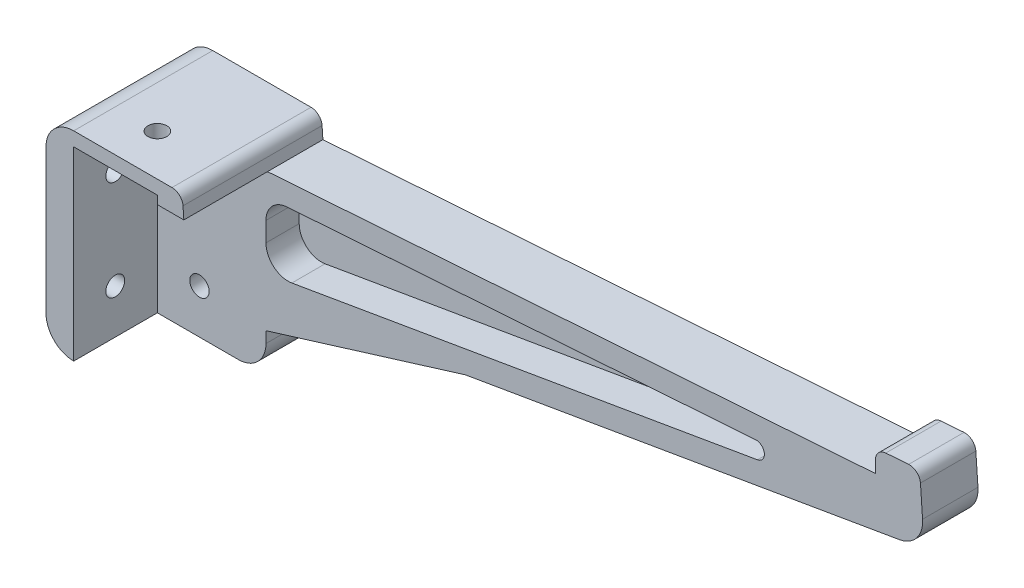
ISO-10303-21;
HEADER;
FILE_DESCRIPTION(('STEP AP214'),'2;1');
FILE_NAME('part.step','',(''),(''),'','','');
FILE_SCHEMA(('AUTOMOTIVE_DESIGN { 1 0 10303 214 1 1 1 1 }'));
ENDSEC;
DATA;
#1=APPLICATION_CONTEXT('core data for automotive mechanical design processes');
#2=APPLICATION_PROTOCOL_DEFINITION('international standard','automotive_design',2000,#1);
#3=PRODUCT_CONTEXT('',#1,'mechanical');
#4=PRODUCT('Part','Part','',(#3));
#5=PRODUCT_RELATED_PRODUCT_CATEGORY('part','',(#4));
#6=PRODUCT_DEFINITION_FORMATION('','',#4);
#7=PRODUCT_DEFINITION_CONTEXT('part definition',#1,'design');
#8=PRODUCT_DEFINITION('design','',#6,#7);
#9=PRODUCT_DEFINITION_SHAPE('','',#8);
#10=(LENGTH_UNIT() NAMED_UNIT(*) SI_UNIT(.MILLI.,.METRE.));
#11=(NAMED_UNIT(*) PLANE_ANGLE_UNIT() SI_UNIT($,.RADIAN.));
#12=(NAMED_UNIT(*) SI_UNIT($,.STERADIAN.) SOLID_ANGLE_UNIT());
#13=UNCERTAINTY_MEASURE_WITH_UNIT(LENGTH_MEASURE(1.E-05),#10,'distance_accuracy_value','');
#14=(GEOMETRIC_REPRESENTATION_CONTEXT(3) GLOBAL_UNCERTAINTY_ASSIGNED_CONTEXT((#13)) GLOBAL_UNIT_ASSIGNED_CONTEXT((#10,
#11,#12)) REPRESENTATION_CONTEXT('',''));
#15=CARTESIAN_POINT('',(0.,0.,0.));
#16=DIRECTION('',(0.,0.,1.));
#17=DIRECTION('',(1.,0.,0.));
#18=AXIS2_PLACEMENT_3D('',#15,#16,#17);
#19=CARTESIAN_POINT('',(124.011071423557,15.8276933308639,10.));
#20=DIRECTION('',(0.,0.,-1.));
#21=DIRECTION('',(-1.,0.,0.));
#22=AXIS2_PLACEMENT_3D('',#19,#20,#21);
#23=PLANE('',#22);
#24=CARTESIAN_POINT('',(0.,-18.,10.));
#25=DIRECTION('',(0.,0.,1.));
#26=DIRECTION('',(1.,0.,0.));
#27=AXIS2_PLACEMENT_3D('',#24,#25,#26);
#28=CIRCLE('',#27,1.75);
#29=CARTESIAN_POINT('',(1.75,-18.,10.));
#30=VERTEX_POINT('',#29);
#31=EDGE_CURVE('E345',#30,#30,#28,.T.);
#32=ORIENTED_EDGE('',*,*,#31,.F.);
#33=EDGE_LOOP('',(#32));
#34=FACE_BOUND('',#33,.T.);
#35=CARTESIAN_POINT('',(0.,0.,10.));
#36=DIRECTION('',(0.,0.,1.));
#37=DIRECTION('',(1.,0.,0.));
#38=AXIS2_PLACEMENT_3D('',#35,#36,#37);
#39=CIRCLE('',#38,1.75);
#40=CARTESIAN_POINT('',(1.75,0.,10.));
#41=VERTEX_POINT('',#40);
#42=EDGE_CURVE('E351',#41,#41,#39,.T.);
#43=ORIENTED_EDGE('',*,*,#42,.F.);
#44=EDGE_LOOP('',(#43));
#45=FACE_BOUND('',#44,.T.);
#46=CARTESIAN_POINT('',(100.464092384595,6.66281392015979,10.));
#47=DIRECTION('',(0.,0.,1.));
#48=DIRECTION('',(1.,0.,0.));
#49=AXIS2_PLACEMENT_3D('',#46,#47,#48);
#50=CIRCLE('',#49,1.5);
#51=CARTESIAN_POINT('',(100.717151125679,5.18431425037256,10.));
#52=VERTEX_POINT('',#51);
#53=CARTESIAN_POINT('',(100.359457673978,8.15915999554953,10.));
#54=VERTEX_POINT('',#53);
#55=EDGE_CURVE('E306',#52,#54,#50,.T.);
#56=ORIENTED_EDGE('',*,*,#55,.F.);
#57=DIRECTION('',(0.985666446524818,0.168705827389386,0.));
#58=VECTOR('',#57,1.);
#59=CARTESIAN_POINT('',(16.6748233095575,-9.20029882024365,10.));
#60=LINE('',#59,#58);
#61=CARTESIAN_POINT('',(16.6748233095575,-9.20029882024365,10.));
#62=VERTEX_POINT('',#61);
#63=EDGE_CURVE('E309',#62,#52,#60,.T.);
#64=ORIENTED_EDGE('',*,*,#63,.F.);
#65=CARTESIAN_POINT('',(16.,-5.25763303414438,10.));
#66=DIRECTION('',(0.,0.,1.));
#67=DIRECTION('',(-1.,0.,0.));
#68=AXIS2_PLACEMENT_3D('',#65,#66,#67);
#69=CIRCLE('',#68,4.);
#70=CARTESIAN_POINT('',(12.,-5.25763303414438,9.99999999999999));
#71=VERTEX_POINT('',#70);
#72=EDGE_CURVE('E296',#71,#62,#69,.T.);
#73=ORIENTED_EDGE('',*,*,#72,.F.);
#74=DIRECTION('',(0.,-1.,0.));
#75=VECTOR('',#74,1.);
#76=CARTESIAN_POINT('',(12.,-5.25763303414438,10.));
#77=LINE('',#76,#75);
#78=CARTESIAN_POINT('',(12.,-1.74959552920002,10.));
#79=VERTEX_POINT('',#78);
#80=EDGE_CURVE('E297',#79,#71,#77,.T.);
#81=ORIENTED_EDGE('',*,*,#80,.F.);
#82=CARTESIAN_POINT('',(16.,-1.74959552920002,10.));
#83=DIRECTION('',(0.,0.,1.));
#84=DIRECTION('',(-1.,0.,0.));
#85=AXIS2_PLACEMENT_3D('',#82,#83,#84);
#86=CIRCLE('',#85,4.);
#87=CARTESIAN_POINT('',(15.7209741050235,2.24066067183928,10.));
#88=VERTEX_POINT('',#87);
#89=EDGE_CURVE('E300',#88,#79,#86,.T.);
#90=ORIENTED_EDGE('',*,*,#89,.F.);
#91=DIRECTION('',(-0.997564050259824,-0.0697564737441258,0.));
#92=VECTOR('',#91,1.);
#93=CARTESIAN_POINT('',(15.7209741050235,2.24066067183928,10.));
#94=LINE('',#93,#92);
#95=EDGE_CURVE('E303',#54,#88,#94,.T.);
#96=ORIENTED_EDGE('',*,*,#95,.F.);
#97=EDGE_LOOP('',(#56,#64,#73,#81,#90,#96));
#98=FACE_BOUND('',#97,.T.);
#99=DIRECTION('',(1.,0.,0.));
#100=VECTOR('',#99,1.);
#101=CARTESIAN_POINT('',(12.2790258949765,6.00974379896071,10.));
#102=LINE('',#101,#100);
#103=CARTESIAN_POINT('',(7.50000000000001,6.0097437989607,10.));
#104=VERTEX_POINT('',#103);
#105=CARTESIAN_POINT('',(12.2790258949765,6.0097437989607,10.));
#106=VERTEX_POINT('',#105);
#107=EDGE_CURVE('E50',#104,#106,#102,.T.);
#108=ORIENTED_EDGE('',*,*,#107,.F.);
#109=DIRECTION('',(0.,-1.,0.));
#110=VECTOR('',#109,1.);
#111=CARTESIAN_POINT('',(7.50000000000001,6.0097437989607,10.));
#112=LINE('',#111,#110);
#113=CARTESIAN_POINT('',(7.50000000000001,7.5,10.));
#114=VERTEX_POINT('',#113);
#115=EDGE_CURVE('E54',#114,#104,#112,.T.);
#116=ORIENTED_EDGE('',*,*,#115,.F.);
#117=DIRECTION('',(1.,0.,0.));
#118=VECTOR('',#117,1.);
#119=CARTESIAN_POINT('',(7.50000000000001,7.5,10.));
#120=LINE('',#119,#118);
#121=CARTESIAN_POINT('',(-7.59999999999999,7.5,10.));
#122=VERTEX_POINT('',#121);
#123=EDGE_CURVE('E269',#122,#114,#120,.T.);
#124=ORIENTED_EDGE('',*,*,#123,.F.);
#125=DIRECTION('',(0.,1.,0.));
#126=VECTOR('',#125,1.);
#127=CARTESIAN_POINT('',(-7.59999999999999,7.5,10.));
#128=LINE('',#127,#126);
#129=CARTESIAN_POINT('',(-7.59999999999999,-26.,10.));
#130=VERTEX_POINT('',#129);
#131=EDGE_CURVE('E266',#130,#122,#128,.T.);
#132=ORIENTED_EDGE('',*,*,#131,.F.);
#133=DIRECTION('',(1.,0.,0.));
#134=VECTOR('',#133,1.);
#135=CARTESIAN_POINT('',(7.,-26.,10.));
#136=LINE('',#135,#134);
#137=CARTESIAN_POINT('',(7.,-26.,10.));
#138=VERTEX_POINT('',#137);
#139=EDGE_CURVE('E359',#130,#138,#136,.T.);
#140=ORIENTED_EDGE('',*,*,#139,.T.);
#141=CARTESIAN_POINT('',(7.,-21.,10.));
#142=DIRECTION('',(0.,0.,1.));
#143=DIRECTION('',(-1.,0.,0.));
#144=AXIS2_PLACEMENT_3D('',#141,#142,#143);
#145=CIRCLE('',#144,5.);
#146=CARTESIAN_POINT('',(12.,-21.,10.));
#147=VERTEX_POINT('',#146);
#148=EDGE_CURVE('E362',#138,#147,#145,.T.);
#149=ORIENTED_EDGE('',*,*,#148,.T.);
#150=DIRECTION('',(0.,1.,0.));
#151=VECTOR('',#150,1.);
#152=CARTESIAN_POINT('',(12.,-21.,10.));
#153=LINE('',#152,#151);
#154=CARTESIAN_POINT('',(12.,-18.9902562010393,10.));
#155=VERTEX_POINT('',#154);
#156=EDGE_CURVE('E364',#147,#155,#153,.T.);
#157=ORIENTED_EDGE('',*,*,#156,.T.);
#158=DIRECTION('',(0.955656131445848,0.294484903568854,0.));
#159=VECTOR('',#158,1.);
#160=CARTESIAN_POINT('',(12.,-18.9902562010393,10.));
#161=LINE('',#160,#159);
#162=CARTESIAN_POINT('',(48.,-7.8968762920553,10.));
#163=VERTEX_POINT('',#162);
#164=EDGE_CURVE('E286',#155,#163,#161,.T.);
#165=ORIENTED_EDGE('',*,*,#164,.T.);
#166=DIRECTION('',(0.985666446524818,0.168705827389386,0.));
#167=VECTOR('',#166,1.);
#168=CARTESIAN_POINT('',(12.,-14.0586055539481,10.));
#169=LINE('',#168,#167);
#170=CARTESIAN_POINT('',(126.368737699881,5.51664993858247,10.));
#171=VERTEX_POINT('',#170);
#172=EDGE_CURVE('E367',#163,#171,#169,.T.);
#173=ORIENTED_EDGE('',*,*,#172,.T.);
#174=CARTESIAN_POINT('',(125.525208562934,10.4449821712066,10.));
#175=DIRECTION('',(0.,0.,1.));
#176=DIRECTION('',(-1.,0.,0.));
#177=AXIS2_PLACEMENT_3D('',#174,#175,#176);
#178=CIRCLE('',#177,4.99999999999998);
#179=CARTESIAN_POINT('',(130.513028814233,10.7937645399272,10.));
#180=VERTEX_POINT('',#179);
#181=EDGE_CURVE('E369',#171,#180,#178,.T.);
#182=ORIENTED_EDGE('',*,*,#181,.T.);
#183=DIRECTION('',(-0.0697564737441267,0.997564050259824,0.));
#184=VECTOR('',#183,1.);
#185=CARTESIAN_POINT('',(130.131096773124,16.2556471925726,10.));
#186=LINE('',#185,#184);
#187=CARTESIAN_POINT('',(130.131096773124,16.2556471925726,10.));
#188=VERTEX_POINT('',#187);
#189=EDGE_CURVE('E371',#180,#188,#186,.T.);
#190=ORIENTED_EDGE('',*,*,#189,.T.);
#191=CARTESIAN_POINT('',(128.135968672604,16.1161342450843,10.));
#192=DIRECTION('',(0.,0.,1.));
#193=DIRECTION('',(-1.,0.,0.));
#194=AXIS2_PLACEMENT_3D('',#191,#192,#193);
#195=CIRCLE('',#194,1.99999999999999);
#196=CARTESIAN_POINT('',(127.996455725116,18.111262345604,10.));
#197=VERTEX_POINT('',#196);
#198=EDGE_CURVE('E373',#188,#197,#195,.T.);
#199=ORIENTED_EDGE('',*,*,#198,.T.);
#200=DIRECTION('',(-0.997564050259824,-0.0697564737441257,0.));
#201=VECTOR('',#200,1.);
#202=CARTESIAN_POINT('',(123.871558476069,17.8228214313835,10.));
#203=LINE('',#202,#201);
#204=CARTESIAN_POINT('',(123.871558476069,17.8228214313835,10.));
#205=VERTEX_POINT('',#204);
#206=EDGE_CURVE('E375',#197,#205,#203,.T.);
#207=ORIENTED_EDGE('',*,*,#206,.T.);
#208=CARTESIAN_POINT('',(124.011071423557,15.8276933308639,10.));
#209=DIRECTION('',(0.,0.,1.));
#210=DIRECTION('',(-1.,0.,0.));
#211=AXIS2_PLACEMENT_3D('',#208,#209,#210);
#212=CIRCLE('',#211,2.);
#213=CARTESIAN_POINT('',(122.011071423557,15.8276933308639,10.));
#214=VERTEX_POINT('',#213);
#215=EDGE_CURVE('E377',#205,#214,#212,.T.);
#216=ORIENTED_EDGE('',*,*,#215,.T.);
#217=DIRECTION('',(0.,-1.,0.));
#218=VECTOR('',#217,1.);
#219=CARTESIAN_POINT('',(122.011071423557,13.6829559108145,10.));
#220=LINE('',#219,#218);
#221=CARTESIAN_POINT('',(122.011071423557,13.6829559108145,10.));
#222=VERTEX_POINT('',#221);
#223=EDGE_CURVE('E379',#214,#222,#220,.T.);
#224=ORIENTED_EDGE('',*,*,#223,.T.);
#225=DIRECTION('',(-0.997564050259824,-0.0697564737441256,0.));
#226=VECTOR('',#225,1.);
#227=CARTESIAN_POINT('',(12.2790258949765,6.0097437989607,10.));
#228=LINE('',#227,#226);
#229=EDGE_CURVE('E357',#222,#106,#228,.T.);
#230=ORIENTED_EDGE('',*,*,#229,.T.);
#231=EDGE_LOOP('',(#108,#116,#124,#132,#140,#149,#157,#165,#173,#182,#190,#199,#207,#216,#224,#230));
#232=FACE_BOUND('',#231,.T.);
#233=ADVANCED_FACE('F35',(#34,#45,#98,#232),#23,.F.);
#234=CARTESIAN_POINT('',(124.011071423557,15.8276933308639,0.));
#235=DIRECTION('',(0.,0.,-1.));
#236=DIRECTION('',(-1.,0.,0.));
#237=AXIS2_PLACEMENT_3D('',#234,#235,#236);
#238=PLANE('',#237);
#239=DIRECTION('',(0.955656131445847,0.294484903568854,0.));
#240=VECTOR('',#239,1.);
#241=CARTESIAN_POINT('',(12.,-18.9902562010393,0.));
#242=LINE('',#241,#240);
#243=CARTESIAN_POINT('',(12.,-18.9902562010393,0.));
#244=VERTEX_POINT('',#243);
#245=CARTESIAN_POINT('',(48.,-7.8968762920553,0.));
#246=VERTEX_POINT('',#245);
#247=EDGE_CURVE('E289',#244,#246,#242,.T.);
#248=ORIENTED_EDGE('',*,*,#247,.F.);
#249=DIRECTION('',(0.,1.,0.));
#250=VECTOR('',#249,1.);
#251=CARTESIAN_POINT('',(12.,-21.,0.));
#252=LINE('',#251,#250);
#253=CARTESIAN_POINT('',(12.,-21.,0.));
#254=VERTEX_POINT('',#253);
#255=EDGE_CURVE('E399',#254,#244,#252,.T.);
#256=ORIENTED_EDGE('',*,*,#255,.F.);
#257=CARTESIAN_POINT('',(7.,-21.,0.));
#258=DIRECTION('',(0.,0.,1.));
#259=DIRECTION('',(-1.,0.,0.));
#260=AXIS2_PLACEMENT_3D('',#257,#258,#259);
#261=CIRCLE('',#260,5.);
#262=CARTESIAN_POINT('',(7.,-26.,0.));
#263=VERTEX_POINT('',#262);
#264=EDGE_CURVE('E397',#263,#254,#261,.T.);
#265=ORIENTED_EDGE('',*,*,#264,.F.);
#266=DIRECTION('',(1.,0.,0.));
#267=VECTOR('',#266,1.);
#268=CARTESIAN_POINT('',(7.,-26.,0.));
#269=LINE('',#268,#267);
#270=CARTESIAN_POINT('',(-7.59999999999999,-26.,0.));
#271=VERTEX_POINT('',#270);
#272=EDGE_CURVE('E395',#271,#263,#269,.T.);
#273=ORIENTED_EDGE('',*,*,#272,.F.);
#274=CARTESIAN_POINT('',(-7.59999999999999,-21.,0.));
#275=DIRECTION('',(0.,0.,1.));
#276=DIRECTION('',(-1.,0.,0.));
#277=AXIS2_PLACEMENT_3D('',#274,#275,#276);
#278=CIRCLE('',#277,5.);
#279=CARTESIAN_POINT('',(-12.6,-21.,0.));
#280=VERTEX_POINT('',#279);
#281=EDGE_CURVE('E393',#280,#271,#278,.T.);
#282=ORIENTED_EDGE('',*,*,#281,.F.);
#283=DIRECTION('',(0.,-1.,0.));
#284=VECTOR('',#283,1.);
#285=CARTESIAN_POINT('',(-12.6,-21.,0.));
#286=LINE('',#285,#284);
#287=CARTESIAN_POINT('',(-12.6,5.,0.));
#288=VERTEX_POINT('',#287);
#289=EDGE_CURVE('E391',#288,#280,#286,.T.);
#290=ORIENTED_EDGE('',*,*,#289,.F.);
#291=CARTESIAN_POINT('',(-7.59999999999999,5.,0.));
#292=DIRECTION('',(0.,0.,1.));
#293=DIRECTION('',(1.,0.,0.));
#294=AXIS2_PLACEMENT_3D('',#291,#292,#293);
#295=CIRCLE('',#294,5.);
#296=CARTESIAN_POINT('',(-7.59999999999999,10.,0.));
#297=VERTEX_POINT('',#296);
#298=EDGE_CURVE('E225',#297,#288,#295,.T.);
#299=ORIENTED_EDGE('',*,*,#298,.F.);
#300=DIRECTION('',(-1.,0.,0.));
#301=VECTOR('',#300,1.);
#302=CARTESIAN_POINT('',(-7.59999999999999,10.,0.));
#303=LINE('',#302,#301);
#304=CARTESIAN_POINT('',(10.1349698277247,10.,0.));
#305=VERTEX_POINT('',#304);
#306=EDGE_CURVE('E388',#305,#297,#303,.T.);
#307=ORIENTED_EDGE('',*,*,#306,.F.);
#308=CARTESIAN_POINT('',(10.1349698277247,8.,0.));
#309=DIRECTION('',(0.,0.,1.));
#310=DIRECTION('',(-1.,0.,0.));
#311=AXIS2_PLACEMENT_3D('',#308,#309,#310);
#312=CIRCLE('',#311,2.);
#313=CARTESIAN_POINT('',(12.1300979282443,8.13951294748825,0.));
#314=VERTEX_POINT('',#313);
#315=EDGE_CURVE('E386',#314,#305,#312,.T.);
#316=ORIENTED_EDGE('',*,*,#315,.F.);
#317=DIRECTION('',(-0.0697564737441258,0.997564050259824,0.));
#318=VECTOR('',#317,1.);
#319=CARTESIAN_POINT('',(12.1300979282443,8.13951294748825,0.));
#320=LINE('',#319,#318);
#321=CARTESIAN_POINT('',(12.2790258949765,6.0097437989607,0.));
#322=VERTEX_POINT('',#321);
#323=EDGE_CURVE('E384',#322,#314,#320,.T.);
#324=ORIENTED_EDGE('',*,*,#323,.F.);
#325=DIRECTION('',(-0.997564050259824,-0.0697564737441256,0.));
#326=VECTOR('',#325,1.);
#327=CARTESIAN_POINT('',(12.2790258949765,6.0097437989607,0.));
#328=LINE('',#327,#326);
#329=CARTESIAN_POINT('',(122.011071423557,13.6829559108145,0.));
#330=VERTEX_POINT('',#329);
#331=EDGE_CURVE('E354',#330,#322,#328,.T.);
#332=ORIENTED_EDGE('',*,*,#331,.F.);
#333=DIRECTION('',(0.,-1.,0.));
#334=VECTOR('',#333,1.);
#335=CARTESIAN_POINT('',(122.011071423557,13.6829559108145,0.));
#336=LINE('',#335,#334);
#337=CARTESIAN_POINT('',(122.011071423557,15.8276933308639,0.));
#338=VERTEX_POINT('',#337);
#339=EDGE_CURVE('E360',#338,#330,#336,.T.);
#340=ORIENTED_EDGE('',*,*,#339,.F.);
#341=CARTESIAN_POINT('',(124.011071423557,15.8276933308639,0.));
#342=DIRECTION('',(0.,0.,1.));
#343=DIRECTION('',(-1.,0.,0.));
#344=AXIS2_PLACEMENT_3D('',#341,#342,#343);
#345=CIRCLE('',#344,2.);
#346=CARTESIAN_POINT('',(123.871558476069,17.8228214313835,0.));
#347=VERTEX_POINT('',#346);
#348=EDGE_CURVE('E412',#347,#338,#345,.T.);
#349=ORIENTED_EDGE('',*,*,#348,.F.);
#350=DIRECTION('',(-0.997564050259824,-0.0697564737441257,0.));
#351=VECTOR('',#350,1.);
#352=CARTESIAN_POINT('',(123.871558476069,17.8228214313835,0.));
#353=LINE('',#352,#351);
#354=CARTESIAN_POINT('',(127.996455725116,18.111262345604,0.));
#355=VERTEX_POINT('',#354);
#356=EDGE_CURVE('E410',#355,#347,#353,.T.);
#357=ORIENTED_EDGE('',*,*,#356,.F.);
#358=CARTESIAN_POINT('',(128.135968672604,16.1161342450843,0.));
#359=DIRECTION('',(0.,0.,1.));
#360=DIRECTION('',(-1.,0.,0.));
#361=AXIS2_PLACEMENT_3D('',#358,#359,#360);
#362=CIRCLE('',#361,1.99999999999999);
#363=CARTESIAN_POINT('',(130.131096773124,16.2556471925726,0.));
#364=VERTEX_POINT('',#363);
#365=EDGE_CURVE('E408',#364,#355,#362,.T.);
#366=ORIENTED_EDGE('',*,*,#365,.F.);
#367=DIRECTION('',(-0.0697564737441267,0.997564050259824,0.));
#368=VECTOR('',#367,1.);
#369=CARTESIAN_POINT('',(130.131096773124,16.2556471925726,0.));
#370=LINE('',#369,#368);
#371=CARTESIAN_POINT('',(130.513028814233,10.7937645399272,0.));
#372=VERTEX_POINT('',#371);
#373=EDGE_CURVE('E406',#372,#364,#370,.T.);
#374=ORIENTED_EDGE('',*,*,#373,.F.);
#375=CARTESIAN_POINT('',(125.525208562934,10.4449821712066,0.));
#376=DIRECTION('',(0.,0.,1.));
#377=DIRECTION('',(-1.,0.,0.));
#378=AXIS2_PLACEMENT_3D('',#375,#376,#377);
#379=CIRCLE('',#378,4.99999999999998);
#380=CARTESIAN_POINT('',(126.368737699881,5.51664993858247,0.));
#381=VERTEX_POINT('',#380);
#382=EDGE_CURVE('E404',#381,#372,#379,.T.);
#383=ORIENTED_EDGE('',*,*,#382,.F.);
#384=DIRECTION('',(0.985666446524818,0.168705827389386,0.));
#385=VECTOR('',#384,1.);
#386=CARTESIAN_POINT('',(12.,-14.0586055539481,0.));
#387=LINE('',#386,#385);
#388=EDGE_CURVE('E402',#246,#381,#387,.T.);
#389=ORIENTED_EDGE('',*,*,#388,.F.);
#390=EDGE_LOOP('',(#248,#256,#265,#273,#282,#290,#299,#307,#316,#324,#332,#340,#349,#357,#366,
#374,#383,#389));
#391=FACE_BOUND('',#390,.T.);
#392=CARTESIAN_POINT('',(0.,0.,0.));
#393=DIRECTION('',(0.,0.,1.));
#394=DIRECTION('',(1.,0.,0.));
#395=AXIS2_PLACEMENT_3D('',#392,#393,#394);
#396=CIRCLE('',#395,1.75);
#397=CARTESIAN_POINT('',(1.75,0.,0.));
#398=VERTEX_POINT('',#397);
#399=EDGE_CURVE('E348',#398,#398,#396,.T.);
#400=ORIENTED_EDGE('',*,*,#399,.T.);
#401=EDGE_LOOP('',(#400));
#402=FACE_BOUND('',#401,.T.);
#403=CARTESIAN_POINT('',(0.,-18.,0.));
#404=DIRECTION('',(0.,0.,1.));
#405=DIRECTION('',(1.,0.,0.));
#406=AXIS2_PLACEMENT_3D('',#403,#404,#405);
#407=CIRCLE('',#406,1.75);
#408=CARTESIAN_POINT('',(1.75,-18.,0.));
#409=VERTEX_POINT('',#408);
#410=EDGE_CURVE('E344',#409,#409,#407,.T.);
#411=ORIENTED_EDGE('',*,*,#410,.T.);
#412=EDGE_LOOP('',(#411));
#413=FACE_BOUND('',#412,.T.);
#414=ADVANCED_FACE('F457',(#391,#402,#413),#238,.T.);
#415=CARTESIAN_POINT('',(12.2790258949765,6.0097437989607,10.));
#416=DIRECTION('',(0.0697564737441256,-0.997564050259824,0.));
#417=DIRECTION('',(0.997564050259824,0.0697564737441256,0.));
#418=AXIS2_PLACEMENT_3D('',#415,#416,#417);
#419=PLANE('',#418);
#420=ORIENTED_EDGE('',*,*,#331,.T.);
#421=DIRECTION('',(0.,0.,-1.));
#422=VECTOR('',#421,1.);
#423=CARTESIAN_POINT('',(12.2790258949765,6.0097437989607,10.));
#424=LINE('',#423,#422);
#425=EDGE_CURVE('E12',#106,#322,#424,.T.);
#426=ORIENTED_EDGE('',*,*,#425,.F.);
#427=ORIENTED_EDGE('',*,*,#229,.F.);
#428=DIRECTION('',(0.,0.,-1.));
#429=VECTOR('',#428,1.);
#430=CARTESIAN_POINT('',(122.011071423557,13.6829559108145,10.));
#431=LINE('',#430,#429);
#432=EDGE_CURVE('E381',#222,#330,#431,.T.);
#433=ORIENTED_EDGE('',*,*,#432,.T.);
#434=EDGE_LOOP('',(#420,#426,#427,#433));
#435=FACE_BOUND('',#434,.T.);
#436=ADVANCED_FACE('F37',(#435),#419,.F.);
#437=CARTESIAN_POINT('',(12.1300979282443,8.13951294748825,10.));
#438=DIRECTION('',(-0.997564050259824,-0.0697564737441258,0.));
#439=DIRECTION('',(0.0697564737441258,-0.997564050259824,0.));
#440=AXIS2_PLACEMENT_3D('',#437,#438,#439);
#441=PLANE('',#440);
#442=ORIENTED_EDGE('',*,*,#323,.T.);
#443=DIRECTION('',(0.,0.,-1.));
#444=VECTOR('',#443,1.);
#445=CARTESIAN_POINT('',(12.1300979282443,8.13951294748825,10.));
#446=LINE('',#445,#444);
#447=CARTESIAN_POINT('',(12.1300979282443,8.13951294748825,25.1));
#448=VERTEX_POINT('',#447);
#449=EDGE_CURVE('E43',#448,#314,#446,.T.);
#450=ORIENTED_EDGE('',*,*,#449,.F.);
#451=DIRECTION('',(-0.0697564737441258,0.997564050259824,0.));
#452=VECTOR('',#451,1.);
#453=CARTESIAN_POINT('',(12.1300979282443,8.13951294748825,25.1));
#454=LINE('',#453,#452);
#455=CARTESIAN_POINT('',(12.2790258949765,6.00974379896071,25.1));
#456=VERTEX_POINT('',#455);
#457=EDGE_CURVE('E259',#456,#448,#454,.T.);
#458=ORIENTED_EDGE('',*,*,#457,.F.);
#459=DIRECTION('',(0.,0.,-1.));
#460=VECTOR('',#459,1.);
#461=CARTESIAN_POINT('',(12.2790258949765,6.00974379896071,25.1));
#462=LINE('',#461,#460);
#463=EDGE_CURVE('E265',#456,#106,#462,.T.);
#464=ORIENTED_EDGE('',*,*,#463,.T.);
#465=ORIENTED_EDGE('',*,*,#425,.T.);
#466=EDGE_LOOP('',(#442,#450,#458,#464,#465));
#467=FACE_BOUND('',#466,.T.);
#468=ADVANCED_FACE('F464',(#467),#441,.F.);
#469=CARTESIAN_POINT('',(10.1349698277247,8.,10.));
#470=DIRECTION('',(0.,0.,-1.));
#471=DIRECTION('',(-1.,0.,0.));
#472=AXIS2_PLACEMENT_3D('',#469,#470,#471);
#473=CYLINDRICAL_SURFACE('',#472,2.);
#474=ORIENTED_EDGE('',*,*,#315,.T.);
#475=DIRECTION('',(0.,0.,-1.));
#476=VECTOR('',#475,1.);
#477=CARTESIAN_POINT('',(10.1349698277247,10.,10.));
#478=LINE('',#477,#476);
#479=CARTESIAN_POINT('',(10.1349698277247,10.,25.1));
#480=VERTEX_POINT('',#479);
#481=EDGE_CURVE('E446',#480,#305,#478,.T.);
#482=ORIENTED_EDGE('',*,*,#481,.F.);
#483=CARTESIAN_POINT('',(10.1349698277247,8.,25.1));
#484=DIRECTION('',(0.,0.,1.));
#485=DIRECTION('',(-1.,0.,0.));
#486=AXIS2_PLACEMENT_3D('',#483,#484,#485);
#487=CIRCLE('',#486,2.);
#488=EDGE_CURVE('E262',#448,#480,#487,.T.);
#489=ORIENTED_EDGE('',*,*,#488,.F.);
#490=ORIENTED_EDGE('',*,*,#449,.T.);
#491=EDGE_LOOP('',(#474,#482,#489,#490));
#492=FACE_BOUND('',#491,.T.);
#493=ADVANCED_FACE('F452',(#492),#473,.T.);
#494=CARTESIAN_POINT('',(-7.59999999999999,10.,10.));
#495=DIRECTION('',(0.,-1.,0.));
#496=DIRECTION('',(0.,0.,-1.));
#497=AXIS2_PLACEMENT_3D('',#494,#495,#496);
#498=PLANE('',#497);
#499=CARTESIAN_POINT('',(0.,10.,17.6));
#500=DIRECTION('',(0.,1.,0.));
#501=DIRECTION('',(0.,0.,1.));
#502=AXIS2_PLACEMENT_3D('',#499,#500,#501);
#503=CIRCLE('',#502,1.69999999999999);
#504=CARTESIAN_POINT('',(0.,10.,19.3));
#505=VERTEX_POINT('',#504);
#506=EDGE_CURVE('E892',#505,#505,#503,.T.);
#507=ORIENTED_EDGE('',*,*,#506,.F.);
#508=EDGE_LOOP('',(#507));
#509=FACE_BOUND('',#508,.T.);
#510=ORIENTED_EDGE('',*,*,#306,.T.);
#511=DIRECTION('',(0.,0.,-1.));
#512=VECTOR('',#511,1.);
#513=CARTESIAN_POINT('',(-7.59999999999999,10.,10.));
#514=LINE('',#513,#512);
#515=CARTESIAN_POINT('',(-7.59999999999999,10.,25.1));
#516=VERTEX_POINT('',#515);
#517=EDGE_CURVE('E228',#516,#297,#514,.T.);
#518=ORIENTED_EDGE('',*,*,#517,.F.);
#519=DIRECTION('',(-1.,0.,0.));
#520=VECTOR('',#519,1.);
#521=CARTESIAN_POINT('',(-7.59999999999999,10.,25.1));
#522=LINE('',#521,#520);
#523=EDGE_CURVE('E243',#480,#516,#522,.T.);
#524=ORIENTED_EDGE('',*,*,#523,.F.);
#525=ORIENTED_EDGE('',*,*,#481,.T.);
#526=EDGE_LOOP('',(#510,#518,#524,#525));
#527=FACE_BOUND('',#526,.T.);
#528=ADVANCED_FACE('F461',(#509,#527),#498,.F.);
#529=CARTESIAN_POINT('',(-7.59999999999999,5.,10.));
#530=DIRECTION('',(0.,0.,-1.));
#531=DIRECTION('',(-1.,0.,0.));
#532=AXIS2_PLACEMENT_3D('',#529,#530,#531);
#533=CYLINDRICAL_SURFACE('',#532,5.);
#534=ORIENTED_EDGE('',*,*,#298,.T.);
#535=DIRECTION('',(0.,0.,-1.));
#536=VECTOR('',#535,1.);
#537=CARTESIAN_POINT('',(-12.6,5.,10.));
#538=LINE('',#537,#536);
#539=CARTESIAN_POINT('',(-12.6,5.,25.1));
#540=VERTEX_POINT('',#539);
#541=EDGE_CURVE('E218',#540,#288,#538,.T.);
#542=ORIENTED_EDGE('',*,*,#541,.F.);
#543=CARTESIAN_POINT('',(-7.6,5.,25.1));
#544=DIRECTION('',(0.,0.,1.));
#545=DIRECTION('',(-1.,0.,0.));
#546=AXIS2_PLACEMENT_3D('',#543,#544,#545);
#547=CIRCLE('',#546,5.);
#548=EDGE_CURVE('E223',#516,#540,#547,.T.);
#549=ORIENTED_EDGE('',*,*,#548,.F.);
#550=ORIENTED_EDGE('',*,*,#517,.T.);
#551=EDGE_LOOP('',(#534,#542,#549,#550));
#552=FACE_BOUND('',#551,.T.);
#553=ADVANCED_FACE('F220',(#552),#533,.T.);
#554=CARTESIAN_POINT('',(-12.6,-21.,10.));
#555=DIRECTION('',(1.,0.,0.));
#556=DIRECTION('',(0.,0.,-1.));
#557=AXIS2_PLACEMENT_3D('',#554,#555,#556);
#558=PLANE('',#557);
#559=CARTESIAN_POINT('',(-12.6,-18.,17.6));
#560=DIRECTION('',(1.,0.,0.));
#561=DIRECTION('',(0.,0.,-1.));
#562=AXIS2_PLACEMENT_3D('',#559,#560,#561);
#563=CIRCLE('',#562,1.7);
#564=CARTESIAN_POINT('',(-12.6,-18.,15.9));
#565=VERTEX_POINT('',#564);
#566=EDGE_CURVE('E899',#565,#565,#563,.T.);
#567=ORIENTED_EDGE('',*,*,#566,.T.);
#568=EDGE_LOOP('',(#567));
#569=FACE_BOUND('',#568,.T.);
#570=CARTESIAN_POINT('',(-12.6,0.,17.6));
#571=DIRECTION('',(1.,0.,0.));
#572=DIRECTION('',(0.,0.,-1.));
#573=AXIS2_PLACEMENT_3D('',#570,#571,#572);
#574=CIRCLE('',#573,1.7);
#575=CARTESIAN_POINT('',(-12.6,0.,15.9));
#576=VERTEX_POINT('',#575);
#577=EDGE_CURVE('E247',#576,#576,#574,.T.);
#578=ORIENTED_EDGE('',*,*,#577,.T.);
#579=EDGE_LOOP('',(#578));
#580=FACE_BOUND('',#579,.T.);
#581=ORIENTED_EDGE('',*,*,#289,.T.);
#582=DIRECTION('',(0.,0.,-1.));
#583=VECTOR('',#582,1.);
#584=CARTESIAN_POINT('',(-12.6,-21.,10.));
#585=LINE('',#584,#583);
#586=CARTESIAN_POINT('',(-12.6,-21.,25.1));
#587=VERTEX_POINT('',#586);
#588=EDGE_CURVE('E229',#587,#280,#585,.T.);
#589=ORIENTED_EDGE('',*,*,#588,.F.);
#590=DIRECTION('',(0.,-1.,0.));
#591=VECTOR('',#590,1.);
#592=CARTESIAN_POINT('',(-12.6,-21.,25.1));
#593=LINE('',#592,#591);
#594=EDGE_CURVE('E232',#540,#587,#593,.T.);
#595=ORIENTED_EDGE('',*,*,#594,.F.);
#596=ORIENTED_EDGE('',*,*,#541,.T.);
#597=EDGE_LOOP('',(#581,#589,#595,#596));
#598=FACE_BOUND('',#597,.T.);
#599=ADVANCED_FACE('F233',(#569,#580,#598),#558,.F.);
#600=CARTESIAN_POINT('',(-7.59999999999999,-21.,10.));
#601=DIRECTION('',(0.,0.,-1.));
#602=DIRECTION('',(-1.,0.,0.));
#603=AXIS2_PLACEMENT_3D('',#600,#601,#602);
#604=CYLINDRICAL_SURFACE('',#603,5.);
#605=ORIENTED_EDGE('',*,*,#281,.T.);
#606=DIRECTION('',(0.,0.,-1.));
#607=VECTOR('',#606,1.);
#608=CARTESIAN_POINT('',(-7.59999999999999,-26.,10.));
#609=LINE('',#608,#607);
#610=EDGE_CURVE('E441',#130,#271,#609,.T.);
#611=ORIENTED_EDGE('',*,*,#610,.F.);
#612=DIRECTION('',(0.,0.,-1.));
#613=VECTOR('',#612,1.);
#614=CARTESIAN_POINT('',(-7.59999999999999,-26.,25.1));
#615=LINE('',#614,#613);
#616=CARTESIAN_POINT('',(-7.59999999999999,-26.,25.1));
#617=VERTEX_POINT('',#616);
#618=EDGE_CURVE('E283',#617,#130,#615,.T.);
#619=ORIENTED_EDGE('',*,*,#618,.F.);
#620=CARTESIAN_POINT('',(-7.59999999999999,-21.,25.1));
#621=DIRECTION('',(0.,0.,1.));
#622=DIRECTION('',(1.,0.,0.));
#623=AXIS2_PLACEMENT_3D('',#620,#621,#622);
#624=CIRCLE('',#623,5.);
#625=EDGE_CURVE('E237',#587,#617,#624,.T.);
#626=ORIENTED_EDGE('',*,*,#625,.F.);
#627=ORIENTED_EDGE('',*,*,#588,.T.);
#628=EDGE_LOOP('',(#605,#611,#619,#626,#627));
#629=FACE_BOUND('',#628,.T.);
#630=ADVANCED_FACE('F483',(#629),#604,.T.);
#631=CARTESIAN_POINT('',(7.,-26.,10.));
#632=DIRECTION('',(0.,1.,0.));
#633=DIRECTION('',(0.,0.,1.));
#634=AXIS2_PLACEMENT_3D('',#631,#632,#633);
#635=PLANE('',#634);
#636=ORIENTED_EDGE('',*,*,#272,.T.);
#637=DIRECTION('',(0.,0.,-1.));
#638=VECTOR('',#637,1.);
#639=CARTESIAN_POINT('',(7.,-26.,10.));
#640=LINE('',#639,#638);
#641=EDGE_CURVE('E438',#138,#263,#640,.T.);
#642=ORIENTED_EDGE('',*,*,#641,.F.);
#643=ORIENTED_EDGE('',*,*,#139,.F.);
#644=ORIENTED_EDGE('',*,*,#610,.T.);
#645=EDGE_LOOP('',(#636,#642,#643,#644));
#646=FACE_BOUND('',#645,.T.);
#647=ADVANCED_FACE('F489',(#646),#635,.F.);
#648=CARTESIAN_POINT('',(7.,-21.,10.));
#649=DIRECTION('',(0.,0.,-1.));
#650=DIRECTION('',(-1.,0.,0.));
#651=AXIS2_PLACEMENT_3D('',#648,#649,#650);
#652=CYLINDRICAL_SURFACE('',#651,5.);
#653=ORIENTED_EDGE('',*,*,#264,.T.);
#654=DIRECTION('',(0.,0.,-1.));
#655=VECTOR('',#654,1.);
#656=CARTESIAN_POINT('',(12.,-21.,10.));
#657=LINE('',#656,#655);
#658=EDGE_CURVE('E435',#147,#254,#657,.T.);
#659=ORIENTED_EDGE('',*,*,#658,.F.);
#660=ORIENTED_EDGE('',*,*,#148,.F.);
#661=ORIENTED_EDGE('',*,*,#641,.T.);
#662=EDGE_LOOP('',(#653,#659,#660,#661));
#663=FACE_BOUND('',#662,.T.);
#664=ADVANCED_FACE('F494',(#663),#652,.T.);
#665=CARTESIAN_POINT('',(12.,-21.,10.));
#666=DIRECTION('',(-1.,0.,0.));
#667=DIRECTION('',(0.,-1.,0.));
#668=AXIS2_PLACEMENT_3D('',#665,#666,#667);
#669=PLANE('',#668);
#670=ORIENTED_EDGE('',*,*,#255,.T.);
#671=DIRECTION('',(0.,0.,1.));
#672=VECTOR('',#671,1.);
#673=CARTESIAN_POINT('',(12.,-18.9902562010393,-37.6704536448003));
#674=LINE('',#673,#672);
#675=EDGE_CURVE('E293',#244,#155,#674,.T.);
#676=ORIENTED_EDGE('',*,*,#675,.T.);
#677=ORIENTED_EDGE('',*,*,#156,.F.);
#678=ORIENTED_EDGE('',*,*,#658,.T.);
#679=EDGE_LOOP('',(#670,#676,#677,#678));
#680=FACE_BOUND('',#679,.T.);
#681=ADVANCED_FACE('F498',(#680),#669,.F.);
#682=CARTESIAN_POINT('',(12.,-14.0586055539481,10.));
#683=DIRECTION('',(-0.168705827389386,0.985666446524818,0.));
#684=DIRECTION('',(-0.985666446524818,-0.168705827389386,0.));
#685=AXIS2_PLACEMENT_3D('',#682,#683,#684);
#686=PLANE('',#685);
#687=ORIENTED_EDGE('',*,*,#172,.F.);
#688=DIRECTION('',(0.,0.,1.));
#689=VECTOR('',#688,1.);
#690=CARTESIAN_POINT('',(48.,-7.8968762920553,-37.6704536448003));
#691=LINE('',#690,#689);
#692=EDGE_CURVE('E291',#246,#163,#691,.T.);
#693=ORIENTED_EDGE('',*,*,#692,.F.);
#694=ORIENTED_EDGE('',*,*,#388,.T.);
#695=DIRECTION('',(0.,0.,-1.));
#696=VECTOR('',#695,1.);
#697=CARTESIAN_POINT('',(126.368737699881,5.51664993858247,10.));
#698=LINE('',#697,#696);
#699=EDGE_CURVE('E432',#171,#381,#698,.T.);
#700=ORIENTED_EDGE('',*,*,#699,.F.);
#701=EDGE_LOOP('',(#687,#693,#694,#700));
#702=FACE_BOUND('',#701,.T.);
#703=ADVANCED_FACE('F506',(#702),#686,.F.);
#704=CARTESIAN_POINT('',(125.525208562934,10.4449821712066,10.));
#705=DIRECTION('',(0.,0.,-1.));
#706=DIRECTION('',(-1.,0.,0.));
#707=AXIS2_PLACEMENT_3D('',#704,#705,#706);
#708=CYLINDRICAL_SURFACE('',#707,4.99999999999998);
#709=ORIENTED_EDGE('',*,*,#382,.T.);
#710=DIRECTION('',(0.,0.,-1.));
#711=VECTOR('',#710,1.);
#712=CARTESIAN_POINT('',(130.513028814233,10.7937645399272,10.));
#713=LINE('',#712,#711);
#714=EDGE_CURVE('E429',#180,#372,#713,.T.);
#715=ORIENTED_EDGE('',*,*,#714,.F.);
#716=ORIENTED_EDGE('',*,*,#181,.F.);
#717=ORIENTED_EDGE('',*,*,#699,.T.);
#718=EDGE_LOOP('',(#709,#715,#716,#717));
#719=FACE_BOUND('',#718,.T.);
#720=ADVANCED_FACE('F512',(#719),#708,.T.);
#721=CARTESIAN_POINT('',(130.131096773124,16.2556471925726,10.));
#722=DIRECTION('',(-0.997564050259824,-0.0697564737441267,0.));
#723=DIRECTION('',(0.0697564737441267,-0.997564050259824,0.));
#724=AXIS2_PLACEMENT_3D('',#721,#722,#723);
#725=PLANE('',#724);
#726=ORIENTED_EDGE('',*,*,#373,.T.);
#727=DIRECTION('',(0.,0.,-1.));
#728=VECTOR('',#727,1.);
#729=CARTESIAN_POINT('',(130.131096773124,16.2556471925726,10.));
#730=LINE('',#729,#728);
#731=EDGE_CURVE('E426',#188,#364,#730,.T.);
#732=ORIENTED_EDGE('',*,*,#731,.F.);
#733=ORIENTED_EDGE('',*,*,#189,.F.);
#734=ORIENTED_EDGE('',*,*,#714,.T.);
#735=EDGE_LOOP('',(#726,#732,#733,#734));
#736=FACE_BOUND('',#735,.T.);
#737=ADVANCED_FACE('F518',(#736),#725,.F.);
#738=CARTESIAN_POINT('',(128.135968672604,16.1161342450843,10.));
#739=DIRECTION('',(0.,0.,-1.));
#740=DIRECTION('',(-1.,0.,0.));
#741=AXIS2_PLACEMENT_3D('',#738,#739,#740);
#742=CYLINDRICAL_SURFACE('',#741,1.99999999999999);
#743=ORIENTED_EDGE('',*,*,#365,.T.);
#744=DIRECTION('',(0.,0.,-1.));
#745=VECTOR('',#744,1.);
#746=CARTESIAN_POINT('',(127.996455725116,18.111262345604,10.));
#747=LINE('',#746,#745);
#748=EDGE_CURVE('E423',#197,#355,#747,.T.);
#749=ORIENTED_EDGE('',*,*,#748,.F.);
#750=ORIENTED_EDGE('',*,*,#198,.F.);
#751=ORIENTED_EDGE('',*,*,#731,.T.);
#752=EDGE_LOOP('',(#743,#749,#750,#751));
#753=FACE_BOUND('',#752,.T.);
#754=ADVANCED_FACE('F522',(#753),#742,.T.);
#755=CARTESIAN_POINT('',(123.871558476069,17.8228214313835,10.));
#756=DIRECTION('',(0.0697564737441257,-0.997564050259824,0.));
#757=DIRECTION('',(0.997564050259824,0.0697564737441257,0.));
#758=AXIS2_PLACEMENT_3D('',#755,#756,#757);
#759=PLANE('',#758);
#760=ORIENTED_EDGE('',*,*,#356,.T.);
#761=DIRECTION('',(0.,0.,-1.));
#762=VECTOR('',#761,1.);
#763=CARTESIAN_POINT('',(123.871558476069,17.8228214313835,10.));
#764=LINE('',#763,#762);
#765=EDGE_CURVE('E420',#205,#347,#764,.T.);
#766=ORIENTED_EDGE('',*,*,#765,.F.);
#767=ORIENTED_EDGE('',*,*,#206,.F.);
#768=ORIENTED_EDGE('',*,*,#748,.T.);
#769=EDGE_LOOP('',(#760,#766,#767,#768));
#770=FACE_BOUND('',#769,.T.);
#771=ADVANCED_FACE('F527',(#770),#759,.F.);
#772=CARTESIAN_POINT('',(124.011071423557,15.8276933308639,10.));
#773=DIRECTION('',(0.,0.,-1.));
#774=DIRECTION('',(-1.,0.,0.));
#775=AXIS2_PLACEMENT_3D('',#772,#773,#774);
#776=CYLINDRICAL_SURFACE('',#775,2.);
#777=ORIENTED_EDGE('',*,*,#348,.T.);
#778=DIRECTION('',(0.,0.,-1.));
#779=VECTOR('',#778,1.);
#780=CARTESIAN_POINT('',(122.011071423557,15.8276933308639,10.));
#781=LINE('',#780,#779);
#782=EDGE_CURVE('E417',#214,#338,#781,.T.);
#783=ORIENTED_EDGE('',*,*,#782,.F.);
#784=ORIENTED_EDGE('',*,*,#215,.F.);
#785=ORIENTED_EDGE('',*,*,#765,.T.);
#786=EDGE_LOOP('',(#777,#783,#784,#785));
#787=FACE_BOUND('',#786,.T.);
#788=ADVANCED_FACE('F533',(#787),#776,.T.);
#789=CARTESIAN_POINT('',(122.011071423557,13.6829559108145,10.));
#790=DIRECTION('',(1.,0.,0.));
#791=DIRECTION('',(0.,0.,-1.));
#792=AXIS2_PLACEMENT_3D('',#789,#790,#791);
#793=PLANE('',#792);
#794=ORIENTED_EDGE('',*,*,#339,.T.);
#795=ORIENTED_EDGE('',*,*,#432,.F.);
#796=ORIENTED_EDGE('',*,*,#223,.F.);
#797=ORIENTED_EDGE('',*,*,#782,.T.);
#798=EDGE_LOOP('',(#794,#795,#796,#797));
#799=FACE_BOUND('',#798,.T.);
#800=ADVANCED_FACE('F537',(#799),#793,.F.);
#801=CARTESIAN_POINT('',(0.,0.,10.));
#802=DIRECTION('',(0.,0.,-1.));
#803=DIRECTION('',(-1.,0.,0.));
#804=AXIS2_PLACEMENT_3D('',#801,#802,#803);
#805=CYLINDRICAL_SURFACE('',#804,1.75);
#806=ORIENTED_EDGE('',*,*,#42,.T.);
#807=EDGE_LOOP('',(#806));
#808=FACE_BOUND('',#807,.T.);
#809=ORIENTED_EDGE('',*,*,#399,.F.);
#810=EDGE_LOOP('',(#809));
#811=FACE_BOUND('',#810,.T.);
#812=ADVANCED_FACE('F554',(#808,#811),#805,.F.);
#813=CARTESIAN_POINT('',(0.,-18.,10.));
#814=DIRECTION('',(0.,0.,-1.));
#815=DIRECTION('',(-1.,0.,0.));
#816=AXIS2_PLACEMENT_3D('',#813,#814,#815);
#817=CYLINDRICAL_SURFACE('',#816,1.75);
#818=ORIENTED_EDGE('',*,*,#31,.T.);
#819=EDGE_LOOP('',(#818));
#820=FACE_BOUND('',#819,.T.);
#821=ORIENTED_EDGE('',*,*,#410,.F.);
#822=EDGE_LOOP('',(#821));
#823=FACE_BOUND('',#822,.T.);
#824=ADVANCED_FACE('F661',(#820,#823),#817,.F.);
#825=CARTESIAN_POINT('',(124.011071423557,15.8276933308639,4.));
#826=DIRECTION('',(0.,0.,-1.));
#827=DIRECTION('',(-1.,0.,0.));
#828=AXIS2_PLACEMENT_3D('',#825,#826,#827);
#829=PLANE('',#828);
#830=CARTESIAN_POINT('',(16.,-5.25763303414438,4.));
#831=DIRECTION('',(0.,0.,-1.));
#832=DIRECTION('',(-1.,0.,0.));
#833=AXIS2_PLACEMENT_3D('',#830,#831,#832);
#834=CIRCLE('',#833,4.);
#835=CARTESIAN_POINT('',(12.,-5.25763303414438,4.));
#836=VERTEX_POINT('',#835);
#837=CARTESIAN_POINT('',(16.6748233095575,-9.20029882024365,4.));
#838=VERTEX_POINT('',#837);
#839=EDGE_CURVE('E317',#836,#838,#834,.F.);
#840=ORIENTED_EDGE('',*,*,#839,.T.);
#841=DIRECTION('',(0.985666446524818,0.168705827389386,0.));
#842=VECTOR('',#841,1.);
#843=CARTESIAN_POINT('',(16.6748233095575,-9.20029882024365,4.));
#844=LINE('',#843,#842);
#845=CARTESIAN_POINT('',(100.717151125679,5.18431425037256,4.));
#846=VERTEX_POINT('',#845);
#847=EDGE_CURVE('E299',#838,#846,#844,.T.);
#848=ORIENTED_EDGE('',*,*,#847,.T.);
#849=CARTESIAN_POINT('',(100.464092384595,6.66281392015979,4.));
#850=DIRECTION('',(0.,0.,-1.));
#851=DIRECTION('',(-1.,0.,0.));
#852=AXIS2_PLACEMENT_3D('',#849,#850,#851);
#853=CIRCLE('',#852,1.5);
#854=CARTESIAN_POINT('',(100.359457673978,8.15915999554953,4.));
#855=VERTEX_POINT('',#854);
#856=EDGE_CURVE('E334',#846,#855,#853,.F.);
#857=ORIENTED_EDGE('',*,*,#856,.T.);
#858=DIRECTION('',(-0.997564050259824,-0.0697564737441258,0.));
#859=VECTOR('',#858,1.);
#860=CARTESIAN_POINT('',(15.7209741050235,2.24066067183928,4.));
#861=LINE('',#860,#859);
#862=CARTESIAN_POINT('',(15.7209741050235,2.24066067183928,4.));
#863=VERTEX_POINT('',#862);
#864=EDGE_CURVE('E330',#855,#863,#861,.T.);
#865=ORIENTED_EDGE('',*,*,#864,.T.);
#866=CARTESIAN_POINT('',(16.,-1.74959552920002,4.));
#867=DIRECTION('',(0.,0.,-1.));
#868=DIRECTION('',(-1.,0.,0.));
#869=AXIS2_PLACEMENT_3D('',#866,#867,#868);
#870=CIRCLE('',#869,4.);
#871=CARTESIAN_POINT('',(12.,-1.74959552920002,4.));
#872=VERTEX_POINT('',#871);
#873=EDGE_CURVE('E326',#863,#872,#870,.F.);
#874=ORIENTED_EDGE('',*,*,#873,.T.);
#875=DIRECTION('',(0.,-1.,0.));
#876=VECTOR('',#875,1.);
#877=CARTESIAN_POINT('',(12.,-5.25763303414438,4.));
#878=LINE('',#877,#876);
#879=EDGE_CURVE('E322',#872,#836,#878,.T.);
#880=ORIENTED_EDGE('',*,*,#879,.T.);
#881=EDGE_LOOP('',(#840,#848,#857,#865,#874,#880));
#882=FACE_BOUND('',#881,.T.);
#883=ADVANCED_FACE('F668',(#882),#829,.F.);
#884=CARTESIAN_POINT('',(16.6748233095575,-9.20029882024365,-91.6352000634669));
#885=DIRECTION('',(0.168705827389386,-0.985666446524818,0.));
#886=DIRECTION('',(0.985666446524818,0.168705827389386,0.));
#887=AXIS2_PLACEMENT_3D('',#884,#885,#886);
#888=PLANE('',#887);
#889=DIRECTION('',(0.,0.,1.));
#890=VECTOR('',#889,1.);
#891=CARTESIAN_POINT('',(16.6748233095575,-9.20029882024365,-91.6352000634669));
#892=LINE('',#891,#890);
#893=EDGE_CURVE('E320',#838,#62,#892,.T.);
#894=ORIENTED_EDGE('',*,*,#893,.T.);
#895=ORIENTED_EDGE('',*,*,#63,.T.);
#896=DIRECTION('',(0.,0.,1.));
#897=VECTOR('',#896,1.);
#898=CARTESIAN_POINT('',(100.717151125679,5.18431425037256,-91.6352000634669));
#899=LINE('',#898,#897);
#900=EDGE_CURVE('E316',#846,#52,#899,.T.);
#901=ORIENTED_EDGE('',*,*,#900,.F.);
#902=ORIENTED_EDGE('',*,*,#847,.F.);
#903=EDGE_LOOP('',(#894,#895,#901,#902));
#904=FACE_BOUND('',#903,.T.);
#905=ADVANCED_FACE('F675',(#904),#888,.F.);
#906=CARTESIAN_POINT('',(100.464092384595,6.66281392015979,-91.6352000634669));
#907=DIRECTION('',(0.,0.,1.));
#908=DIRECTION('',(1.,0.,0.));
#909=AXIS2_PLACEMENT_3D('',#906,#907,#908);
#910=CYLINDRICAL_SURFACE('',#909,1.5);
#911=ORIENTED_EDGE('',*,*,#900,.T.);
#912=ORIENTED_EDGE('',*,*,#55,.T.);
#913=DIRECTION('',(0.,0.,1.));
#914=VECTOR('',#913,1.);
#915=CARTESIAN_POINT('',(100.359457673978,8.15915999554953,-91.6352000634669));
#916=LINE('',#915,#914);
#917=EDGE_CURVE('E333',#855,#54,#916,.T.);
#918=ORIENTED_EDGE('',*,*,#917,.F.);
#919=ORIENTED_EDGE('',*,*,#856,.F.);
#920=EDGE_LOOP('',(#911,#912,#918,#919));
#921=FACE_BOUND('',#920,.T.);
#922=ADVANCED_FACE('F683',(#921),#910,.F.);
#923=CARTESIAN_POINT('',(15.7209741050235,2.24066067183928,-91.6352000634669));
#924=DIRECTION('',(-0.0697564737441258,0.997564050259824,0.));
#925=DIRECTION('',(-0.997564050259824,-0.0697564737441258,0.));
#926=AXIS2_PLACEMENT_3D('',#923,#924,#925);
#927=PLANE('',#926);
#928=ORIENTED_EDGE('',*,*,#917,.T.);
#929=ORIENTED_EDGE('',*,*,#95,.T.);
#930=DIRECTION('',(0.,0.,1.));
#931=VECTOR('',#930,1.);
#932=CARTESIAN_POINT('',(15.7209741050235,2.24066067183928,-91.6352000634669));
#933=LINE('',#932,#931);
#934=EDGE_CURVE('E329',#863,#88,#933,.T.);
#935=ORIENTED_EDGE('',*,*,#934,.F.);
#936=ORIENTED_EDGE('',*,*,#864,.F.);
#937=EDGE_LOOP('',(#928,#929,#935,#936));
#938=FACE_BOUND('',#937,.T.);
#939=ADVANCED_FACE('F691',(#938),#927,.F.);
#940=CARTESIAN_POINT('',(16.,-1.74959552920002,-91.6352000634669));
#941=DIRECTION('',(0.,0.,1.));
#942=DIRECTION('',(1.,0.,0.));
#943=AXIS2_PLACEMENT_3D('',#940,#941,#942);
#944=CYLINDRICAL_SURFACE('',#943,4.);
#945=ORIENTED_EDGE('',*,*,#934,.T.);
#946=ORIENTED_EDGE('',*,*,#89,.T.);
#947=DIRECTION('',(0.,0.,1.));
#948=VECTOR('',#947,1.);
#949=CARTESIAN_POINT('',(12.,-1.74959552920002,-91.6352000634669));
#950=LINE('',#949,#948);
#951=EDGE_CURVE('E325',#872,#79,#950,.T.);
#952=ORIENTED_EDGE('',*,*,#951,.F.);
#953=ORIENTED_EDGE('',*,*,#873,.F.);
#954=EDGE_LOOP('',(#945,#946,#952,#953));
#955=FACE_BOUND('',#954,.T.);
#956=ADVANCED_FACE('F699',(#955),#944,.F.);
#957=CARTESIAN_POINT('',(12.,-5.25763303414438,-91.6352000634669));
#958=DIRECTION('',(-1.,0.,0.));
#959=DIRECTION('',(0.,0.,1.));
#960=AXIS2_PLACEMENT_3D('',#957,#958,#959);
#961=PLANE('',#960);
#962=ORIENTED_EDGE('',*,*,#951,.T.);
#963=ORIENTED_EDGE('',*,*,#80,.T.);
#964=DIRECTION('',(0.,0.,1.));
#965=VECTOR('',#964,1.);
#966=CARTESIAN_POINT('',(12.,-5.25763303414438,-91.6352000634669));
#967=LINE('',#966,#965);
#968=EDGE_CURVE('E321',#836,#71,#967,.T.);
#969=ORIENTED_EDGE('',*,*,#968,.F.);
#970=ORIENTED_EDGE('',*,*,#879,.F.);
#971=EDGE_LOOP('',(#962,#963,#969,#970));
#972=FACE_BOUND('',#971,.T.);
#973=ADVANCED_FACE('F707',(#972),#961,.F.);
#974=CARTESIAN_POINT('',(16.,-5.25763303414438,-91.6352000634669));
#975=DIRECTION('',(0.,0.,1.));
#976=DIRECTION('',(1.,0.,0.));
#977=AXIS2_PLACEMENT_3D('',#974,#975,#976);
#978=CYLINDRICAL_SURFACE('',#977,4.);
#979=ORIENTED_EDGE('',*,*,#968,.T.);
#980=ORIENTED_EDGE('',*,*,#72,.T.);
#981=ORIENTED_EDGE('',*,*,#893,.F.);
#982=ORIENTED_EDGE('',*,*,#839,.F.);
#983=EDGE_LOOP('',(#979,#980,#981,#982));
#984=FACE_BOUND('',#983,.T.);
#985=ADVANCED_FACE('F715',(#984),#978,.F.);
#986=CARTESIAN_POINT('',(12.,-18.9902562010393,-37.6704536448003));
#987=DIRECTION('',(0.294484903568854,-0.955656131445847,0.));
#988=DIRECTION('',(0.955656131445847,0.294484903568854,0.));
#989=AXIS2_PLACEMENT_3D('',#986,#987,#988);
#990=PLANE('',#989);
#991=ORIENTED_EDGE('',*,*,#675,.F.);
#992=ORIENTED_EDGE('',*,*,#247,.T.);
#993=ORIENTED_EDGE('',*,*,#692,.T.);
#994=ORIENTED_EDGE('',*,*,#164,.F.);
#995=EDGE_LOOP('',(#991,#992,#993,#994));
#996=FACE_BOUND('',#995,.T.);
#997=ADVANCED_FACE('F501',(#996),#990,.T.);
#998=CARTESIAN_POINT('',(-7.59999999999999,7.5,25.1));
#999=DIRECTION('',(-1.,0.,0.));
#1000=DIRECTION('',(0.,-1.,0.));
#1001=AXIS2_PLACEMENT_3D('',#998,#999,#1000);
#1002=PLANE('',#1001);
#1003=CARTESIAN_POINT('',(-7.59999999999999,-18.,17.6));
#1004=DIRECTION('',(1.,0.,0.));
#1005=DIRECTION('',(0.,0.,-1.));
#1006=AXIS2_PLACEMENT_3D('',#1003,#1004,#1005);
#1007=CIRCLE('',#1006,1.7);
#1008=CARTESIAN_POINT('',(-7.59999999999999,-18.,15.9));
#1009=VERTEX_POINT('',#1008);
#1010=EDGE_CURVE('E896',#1009,#1009,#1007,.T.);
#1011=ORIENTED_EDGE('',*,*,#1010,.F.);
#1012=EDGE_LOOP('',(#1011));
#1013=FACE_BOUND('',#1012,.T.);
#1014=CARTESIAN_POINT('',(-7.59999999999999,0.,17.6));
#1015=DIRECTION('',(1.,0.,0.));
#1016=DIRECTION('',(0.,0.,-1.));
#1017=AXIS2_PLACEMENT_3D('',#1014,#1015,#1016);
#1018=CIRCLE('',#1017,1.7);
#1019=CARTESIAN_POINT('',(-7.59999999999999,0.,15.9));
#1020=VERTEX_POINT('',#1019);
#1021=EDGE_CURVE('E904',#1020,#1020,#1018,.T.);
#1022=ORIENTED_EDGE('',*,*,#1021,.F.);
#1023=EDGE_LOOP('',(#1022));
#1024=FACE_BOUND('',#1023,.T.);
#1025=ORIENTED_EDGE('',*,*,#131,.T.);
#1026=DIRECTION('',(0.,0.,-1.));
#1027=VECTOR('',#1026,1.);
#1028=CARTESIAN_POINT('',(-7.59999999999999,7.5,25.1));
#1029=LINE('',#1028,#1027);
#1030=CARTESIAN_POINT('',(-7.59999999999999,7.5,25.1));
#1031=VERTEX_POINT('',#1030);
#1032=EDGE_CURVE('E280',#1031,#122,#1029,.T.);
#1033=ORIENTED_EDGE('',*,*,#1032,.F.);
#1034=DIRECTION('',(0.,1.,0.));
#1035=VECTOR('',#1034,1.);
#1036=CARTESIAN_POINT('',(-7.59999999999999,7.5,25.1));
#1037=LINE('',#1036,#1035);
#1038=EDGE_CURVE('E251',#617,#1031,#1037,.T.);
#1039=ORIENTED_EDGE('',*,*,#1038,.F.);
#1040=ORIENTED_EDGE('',*,*,#618,.T.);
#1041=EDGE_LOOP('',(#1025,#1033,#1039,#1040));
#1042=FACE_BOUND('',#1041,.T.);
#1043=ADVANCED_FACE('F479',(#1013,#1024,#1042),#1002,.F.);
#1044=CARTESIAN_POINT('',(7.50000000000001,7.5,25.1));
#1045=DIRECTION('',(0.,1.,0.));
#1046=DIRECTION('',(-1.,0.,0.));
#1047=AXIS2_PLACEMENT_3D('',#1044,#1045,#1046);
#1048=PLANE('',#1047);
#1049=CARTESIAN_POINT('',(0.,7.5,17.6));
#1050=DIRECTION('',(0.,1.,0.));
#1051=DIRECTION('',(-1.,0.,0.));
#1052=AXIS2_PLACEMENT_3D('',#1049,#1050,#1051);
#1053=CIRCLE('',#1052,1.69999999999999);
#1054=CARTESIAN_POINT('',(-1.69999999999998,7.5,17.6));
#1055=VERTEX_POINT('',#1054);
#1056=EDGE_CURVE('E895',#1055,#1055,#1053,.T.);
#1057=ORIENTED_EDGE('',*,*,#1056,.T.);
#1058=EDGE_LOOP('',(#1057));
#1059=FACE_BOUND('',#1058,.T.);
#1060=ORIENTED_EDGE('',*,*,#123,.T.);
#1061=DIRECTION('',(0.,0.,-1.));
#1062=VECTOR('',#1061,1.);
#1063=CARTESIAN_POINT('',(7.50000000000001,7.5,25.1));
#1064=LINE('',#1063,#1062);
#1065=CARTESIAN_POINT('',(7.50000000000001,7.5,25.1));
#1066=VERTEX_POINT('',#1065);
#1067=EDGE_CURVE('E277',#1066,#114,#1064,.T.);
#1068=ORIENTED_EDGE('',*,*,#1067,.F.);
#1069=DIRECTION('',(1.,0.,0.));
#1070=VECTOR('',#1069,1.);
#1071=CARTESIAN_POINT('',(7.50000000000001,7.5,25.1));
#1072=LINE('',#1071,#1070);
#1073=EDGE_CURVE('E253',#1031,#1066,#1072,.T.);
#1074=ORIENTED_EDGE('',*,*,#1073,.F.);
#1075=ORIENTED_EDGE('',*,*,#1032,.T.);
#1076=EDGE_LOOP('',(#1060,#1068,#1074,#1075));
#1077=FACE_BOUND('',#1076,.T.);
#1078=ADVANCED_FACE('F475',(#1059,#1077),#1048,.F.);
#1079=CARTESIAN_POINT('',(7.50000000000001,6.0097437989607,25.1));
#1080=DIRECTION('',(1.,0.,0.));
#1081=DIRECTION('',(0.,1.,0.));
#1082=AXIS2_PLACEMENT_3D('',#1079,#1080,#1081);
#1083=PLANE('',#1082);
#1084=ORIENTED_EDGE('',*,*,#115,.T.);
#1085=DIRECTION('',(0.,0.,-1.));
#1086=VECTOR('',#1085,1.);
#1087=CARTESIAN_POINT('',(7.50000000000001,6.0097437989607,25.1));
#1088=LINE('',#1087,#1086);
#1089=CARTESIAN_POINT('',(7.50000000000001,6.0097437989607,25.1));
#1090=VERTEX_POINT('',#1089);
#1091=EDGE_CURVE('E274',#1090,#104,#1088,.T.);
#1092=ORIENTED_EDGE('',*,*,#1091,.F.);
#1093=DIRECTION('',(0.,-1.,0.));
#1094=VECTOR('',#1093,1.);
#1095=CARTESIAN_POINT('',(7.50000000000001,6.0097437989607,25.1));
#1096=LINE('',#1095,#1094);
#1097=EDGE_CURVE('E255',#1066,#1090,#1096,.T.);
#1098=ORIENTED_EDGE('',*,*,#1097,.F.);
#1099=ORIENTED_EDGE('',*,*,#1067,.T.);
#1100=EDGE_LOOP('',(#1084,#1092,#1098,#1099));
#1101=FACE_BOUND('',#1100,.T.);
#1102=ADVANCED_FACE('F471',(#1101),#1083,.F.);
#1103=CARTESIAN_POINT('',(12.2790258949765,6.00974379896071,25.1));
#1104=DIRECTION('',(0.,1.,0.));
#1105=DIRECTION('',(-1.,0.,0.));
#1106=AXIS2_PLACEMENT_3D('',#1103,#1104,#1105);
#1107=PLANE('',#1106);
#1108=ORIENTED_EDGE('',*,*,#107,.T.);
#1109=ORIENTED_EDGE('',*,*,#463,.F.);
#1110=DIRECTION('',(1.,0.,0.));
#1111=VECTOR('',#1110,1.);
#1112=CARTESIAN_POINT('',(12.2790258949765,6.00974379896071,25.1));
#1113=LINE('',#1112,#1111);
#1114=EDGE_CURVE('E257',#1090,#456,#1113,.T.);
#1115=ORIENTED_EDGE('',*,*,#1114,.F.);
#1116=ORIENTED_EDGE('',*,*,#1091,.T.);
#1117=EDGE_LOOP('',(#1108,#1109,#1115,#1116));
#1118=FACE_BOUND('',#1117,.T.);
#1119=ADVANCED_FACE('F467',(#1118),#1107,.F.);
#1120=CARTESIAN_POINT('',(-7.6,5.,25.1));
#1121=DIRECTION('',(0.,0.,-1.));
#1122=DIRECTION('',(-1.,0.,0.));
#1123=AXIS2_PLACEMENT_3D('',#1120,#1121,#1122);
#1124=PLANE('',#1123);
#1125=ORIENTED_EDGE('',*,*,#548,.T.);
#1126=ORIENTED_EDGE('',*,*,#594,.T.);
#1127=ORIENTED_EDGE('',*,*,#625,.T.);
#1128=ORIENTED_EDGE('',*,*,#1038,.T.);
#1129=ORIENTED_EDGE('',*,*,#1073,.T.);
#1130=ORIENTED_EDGE('',*,*,#1097,.T.);
#1131=ORIENTED_EDGE('',*,*,#1114,.T.);
#1132=ORIENTED_EDGE('',*,*,#457,.T.);
#1133=ORIENTED_EDGE('',*,*,#488,.T.);
#1134=ORIENTED_EDGE('',*,*,#523,.T.);
#1135=EDGE_LOOP('',(#1125,#1126,#1127,#1128,#1129,#1130,#1131,#1132,#1133,#1134));
#1136=FACE_BOUND('',#1135,.T.);
#1137=ADVANCED_FACE('F240',(#1136),#1124,.F.);
#1138=CARTESIAN_POINT('',(-7.59999999999999,0.,17.6));
#1139=DIRECTION('',(1.,0.,0.));
#1140=DIRECTION('',(0.,0.,-1.));
#1141=AXIS2_PLACEMENT_3D('',#1138,#1139,#1140);
#1142=CYLINDRICAL_SURFACE('',#1141,1.7);
#1143=ORIENTED_EDGE('',*,*,#577,.F.);
#1144=EDGE_LOOP('',(#1143));
#1145=FACE_BOUND('',#1144,.T.);
#1146=ORIENTED_EDGE('',*,*,#1021,.T.);
#1147=EDGE_LOOP('',(#1146));
#1148=FACE_BOUND('',#1147,.T.);
#1149=ADVANCED_FACE('F759',(#1145,#1148),#1142,.F.);
#1150=CARTESIAN_POINT('',(-7.59999999999999,-18.,17.6));
#1151=DIRECTION('',(1.,0.,0.));
#1152=DIRECTION('',(0.,0.,-1.));
#1153=AXIS2_PLACEMENT_3D('',#1150,#1151,#1152);
#1154=CYLINDRICAL_SURFACE('',#1153,1.7);
#1155=ORIENTED_EDGE('',*,*,#566,.F.);
#1156=EDGE_LOOP('',(#1155));
#1157=FACE_BOUND('',#1156,.T.);
#1158=ORIENTED_EDGE('',*,*,#1010,.T.);
#1159=EDGE_LOOP('',(#1158));
#1160=FACE_BOUND('',#1159,.T.);
#1161=ADVANCED_FACE('F765',(#1157,#1160),#1154,.F.);
#1162=CARTESIAN_POINT('',(0.,10.,17.6));
#1163=DIRECTION('',(0.,1.,0.));
#1164=DIRECTION('',(0.,0.,1.));
#1165=AXIS2_PLACEMENT_3D('',#1162,#1163,#1164);
#1166=CYLINDRICAL_SURFACE('',#1165,1.69999999999999);
#1167=ORIENTED_EDGE('',*,*,#506,.T.);
#1168=EDGE_LOOP('',(#1167));
#1169=FACE_BOUND('',#1168,.T.);
#1170=ORIENTED_EDGE('',*,*,#1056,.F.);
#1171=EDGE_LOOP('',(#1170));
#1172=FACE_BOUND('',#1171,.T.);
#1173=ADVANCED_FACE('F772',(#1169,#1172),#1166,.F.);
#1174=CLOSED_SHELL('',(#233,#414,#436,#468,#493,#528,#553,#599,#630,#647,#664,#681,#703,#720,
#737,#754,#771,#788,#800,#812,#824,#883,#905,#922,#939,#956,#973,#985,#997,#1043,#1078,#1102,
#1119,#1137,#1149,#1161,#1173));
#1175=MANIFOLD_SOLID_BREP('B2',#1174);
#1176=ADVANCED_BREP_SHAPE_REPRESENTATION('',(#18,#1175),#14);
#1177=SHAPE_DEFINITION_REPRESENTATION(#9,#1176);
ENDSEC;
END-ISO-10303-21;
